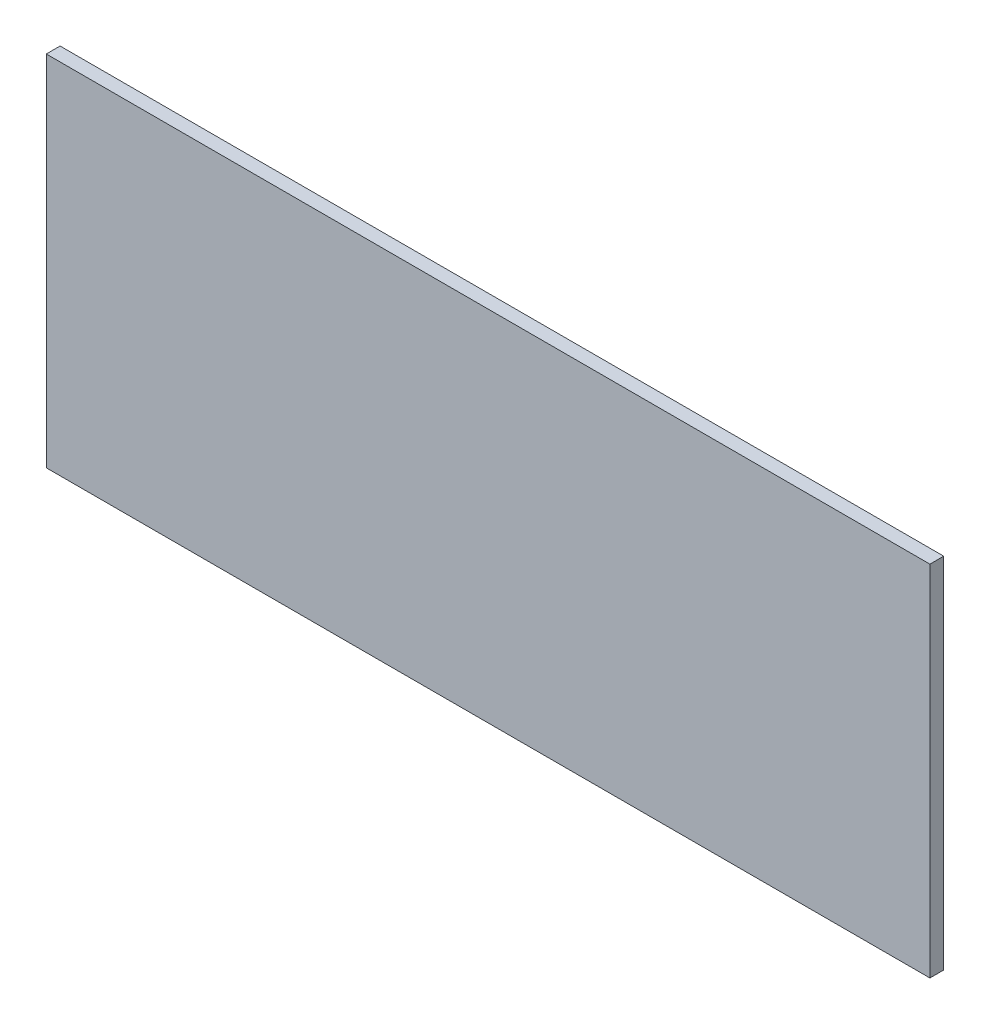
ISO-10303-21;
HEADER;
FILE_DESCRIPTION(('STEP AP214'),'2;1');
FILE_NAME('part.step','',(''),(''),'','','');
FILE_SCHEMA(('AUTOMOTIVE_DESIGN { 1 0 10303 214 1 1 1 1 }'));
ENDSEC;
DATA;
#1=APPLICATION_CONTEXT('core data for automotive mechanical design processes');
#2=APPLICATION_PROTOCOL_DEFINITION('international standard','automotive_design',2000,#1);
#3=PRODUCT_CONTEXT('',#1,'mechanical');
#4=PRODUCT('Part','Part','',(#3));
#5=PRODUCT_RELATED_PRODUCT_CATEGORY('part','',(#4));
#6=PRODUCT_DEFINITION_FORMATION('','',#4);
#7=PRODUCT_DEFINITION_CONTEXT('part definition',#1,'design');
#8=PRODUCT_DEFINITION('design','',#6,#7);
#9=PRODUCT_DEFINITION_SHAPE('','',#8);
#10=(LENGTH_UNIT() NAMED_UNIT(*) SI_UNIT(.MILLI.,.METRE.));
#11=(NAMED_UNIT(*) PLANE_ANGLE_UNIT() SI_UNIT($,.RADIAN.));
#12=(NAMED_UNIT(*) SI_UNIT($,.STERADIAN.) SOLID_ANGLE_UNIT());
#13=UNCERTAINTY_MEASURE_WITH_UNIT(LENGTH_MEASURE(1.E-05),#10,'distance_accuracy_value','');
#14=(GEOMETRIC_REPRESENTATION_CONTEXT(3) GLOBAL_UNCERTAINTY_ASSIGNED_CONTEXT((#13)) GLOBAL_UNIT_ASSIGNED_CONTEXT((#10,
#11,#12)) REPRESENTATION_CONTEXT('',''));
#15=CARTESIAN_POINT('',(0.,0.,0.));
#16=DIRECTION('',(0.,0.,1.));
#17=DIRECTION('',(1.,0.,0.));
#18=AXIS2_PLACEMENT_3D('',#15,#16,#17);
#19=CARTESIAN_POINT('',(80.,32.45,2.5));
#20=DIRECTION('',(-1.,0.,0.));
#21=DIRECTION('',(0.,0.,1.));
#22=AXIS2_PLACEMENT_3D('',#19,#20,#21);
#23=PLANE('',#22);
#24=DIRECTION('',(0.,1.,0.));
#25=VECTOR('',#24,1.);
#26=CARTESIAN_POINT('',(80.,32.45,0.));
#27=LINE('',#26,#25);
#28=CARTESIAN_POINT('',(80.,-32.45,0.));
#29=VERTEX_POINT('',#28);
#30=CARTESIAN_POINT('',(80.,32.45,0.));
#31=VERTEX_POINT('',#30);
#32=EDGE_CURVE('E102',#29,#31,#27,.T.);
#33=ORIENTED_EDGE('',*,*,#32,.T.);
#34=DIRECTION('',(0.,0.,-1.));
#35=VECTOR('',#34,1.);
#36=CARTESIAN_POINT('',(80.,32.45,2.5));
#37=LINE('',#36,#35);
#38=CARTESIAN_POINT('',(80.,32.45,2.5));
#39=VERTEX_POINT('',#38);
#40=EDGE_CURVE('E11',#39,#31,#37,.T.);
#41=ORIENTED_EDGE('',*,*,#40,.F.);
#42=DIRECTION('',(0.,1.,0.));
#43=VECTOR('',#42,1.);
#44=CARTESIAN_POINT('',(80.,32.45,2.5));
#45=LINE('',#44,#43);
#46=CARTESIAN_POINT('',(80.,-32.45,2.5));
#47=VERTEX_POINT('',#46);
#48=EDGE_CURVE('E90',#47,#39,#45,.T.);
#49=ORIENTED_EDGE('',*,*,#48,.F.);
#50=DIRECTION('',(0.,0.,-1.));
#51=VECTOR('',#50,1.);
#52=CARTESIAN_POINT('',(80.,-32.45,2.5));
#53=LINE('',#52,#51);
#54=EDGE_CURVE('E98',#47,#29,#53,.T.);
#55=ORIENTED_EDGE('',*,*,#54,.T.);
#56=EDGE_LOOP('',(#33,#41,#49,#55));
#57=FACE_BOUND('',#56,.T.);
#58=ADVANCED_FACE('F39',(#57),#23,.F.);
#59=CARTESIAN_POINT('',(-80.,32.45,2.5));
#60=DIRECTION('',(0.,-1.,0.));
#61=DIRECTION('',(0.,0.,-1.));
#62=AXIS2_PLACEMENT_3D('',#59,#60,#61);
#63=PLANE('',#62);
#64=DIRECTION('',(-1.,0.,0.));
#65=VECTOR('',#64,1.);
#66=CARTESIAN_POINT('',(-80.,32.45,0.));
#67=LINE('',#66,#65);
#68=CARTESIAN_POINT('',(-80.,32.45,0.));
#69=VERTEX_POINT('',#68);
#70=EDGE_CURVE('E94',#31,#69,#67,.T.);
#71=ORIENTED_EDGE('',*,*,#70,.T.);
#72=DIRECTION('',(0.,0.,-1.));
#73=VECTOR('',#72,1.);
#74=CARTESIAN_POINT('',(-80.,32.45,2.5));
#75=LINE('',#74,#73);
#76=CARTESIAN_POINT('',(-80.,32.45,2.5));
#77=VERTEX_POINT('',#76);
#78=EDGE_CURVE('E47',#77,#69,#75,.T.);
#79=ORIENTED_EDGE('',*,*,#78,.F.);
#80=DIRECTION('',(-1.,0.,0.));
#81=VECTOR('',#80,1.);
#82=CARTESIAN_POINT('',(-80.,32.45,2.5));
#83=LINE('',#82,#81);
#84=EDGE_CURVE('E85',#39,#77,#83,.T.);
#85=ORIENTED_EDGE('',*,*,#84,.F.);
#86=ORIENTED_EDGE('',*,*,#40,.T.);
#87=EDGE_LOOP('',(#71,#79,#85,#86));
#88=FACE_BOUND('',#87,.T.);
#89=ADVANCED_FACE('F93',(#88),#63,.F.);
#90=CARTESIAN_POINT('',(-80.,32.45,2.5));
#91=DIRECTION('',(1.,0.,0.));
#92=DIRECTION('',(0.,1.,0.));
#93=AXIS2_PLACEMENT_3D('',#90,#91,#92);
#94=PLANE('',#93);
#95=DIRECTION('',(0.,-1.,0.));
#96=VECTOR('',#95,1.);
#97=CARTESIAN_POINT('',(-80.,32.45,0.));
#98=LINE('',#97,#96);
#99=CARTESIAN_POINT('',(-80.,-32.45,0.));
#100=VERTEX_POINT('',#99);
#101=EDGE_CURVE('E72',#69,#100,#98,.T.);
#102=ORIENTED_EDGE('',*,*,#101,.T.);
#103=DIRECTION('',(0.,0.,-1.));
#104=VECTOR('',#103,1.);
#105=CARTESIAN_POINT('',(-80.,-32.45,2.5));
#106=LINE('',#105,#104);
#107=CARTESIAN_POINT('',(-80.,-32.45,2.5));
#108=VERTEX_POINT('',#107);
#109=EDGE_CURVE('E95',#108,#100,#106,.T.);
#110=ORIENTED_EDGE('',*,*,#109,.F.);
#111=DIRECTION('',(0.,-1.,0.));
#112=VECTOR('',#111,1.);
#113=CARTESIAN_POINT('',(-80.,32.45,2.5));
#114=LINE('',#113,#112);
#115=EDGE_CURVE('E88',#77,#108,#114,.T.);
#116=ORIENTED_EDGE('',*,*,#115,.F.);
#117=ORIENTED_EDGE('',*,*,#78,.T.);
#118=EDGE_LOOP('',(#102,#110,#116,#117));
#119=FACE_BOUND('',#118,.T.);
#120=ADVANCED_FACE('F96',(#119),#94,.F.);
#121=CARTESIAN_POINT('',(-80.,-32.45,2.5));
#122=DIRECTION('',(0.,1.,0.));
#123=DIRECTION('',(0.,0.,1.));
#124=AXIS2_PLACEMENT_3D('',#121,#122,#123);
#125=PLANE('',#124);
#126=DIRECTION('',(1.,0.,0.));
#127=VECTOR('',#126,1.);
#128=CARTESIAN_POINT('',(-80.,-32.45,0.));
#129=LINE('',#128,#127);
#130=EDGE_CURVE('E78',#100,#29,#129,.T.);
#131=ORIENTED_EDGE('',*,*,#130,.T.);
#132=ORIENTED_EDGE('',*,*,#54,.F.);
#133=DIRECTION('',(1.,0.,0.));
#134=VECTOR('',#133,1.);
#135=CARTESIAN_POINT('',(-80.,-32.45,2.5));
#136=LINE('',#135,#134);
#137=EDGE_CURVE('E55',#108,#47,#136,.T.);
#138=ORIENTED_EDGE('',*,*,#137,.F.);
#139=ORIENTED_EDGE('',*,*,#109,.T.);
#140=EDGE_LOOP('',(#131,#132,#138,#139));
#141=FACE_BOUND('',#140,.T.);
#142=ADVANCED_FACE('F109',(#141),#125,.F.);
#143=CARTESIAN_POINT('',(0.,0.,2.5));
#144=DIRECTION('',(0.,0.,1.));
#145=DIRECTION('',(1.,0.,0.));
#146=AXIS2_PLACEMENT_3D('',#143,#144,#145);
#147=PLANE('',#146);
#148=ORIENTED_EDGE('',*,*,#48,.T.);
#149=ORIENTED_EDGE('',*,*,#84,.T.);
#150=ORIENTED_EDGE('',*,*,#115,.T.);
#151=ORIENTED_EDGE('',*,*,#137,.T.);
#152=EDGE_LOOP('',(#148,#149,#150,#151));
#153=FACE_BOUND('',#152,.T.);
#154=ADVANCED_FACE('F86',(#153),#147,.T.);
#155=CARTESIAN_POINT('',(0.,0.,0.));
#156=DIRECTION('',(0.,0.,1.));
#157=DIRECTION('',(1.,0.,0.));
#158=AXIS2_PLACEMENT_3D('',#155,#156,#157);
#159=PLANE('',#158);
#160=ORIENTED_EDGE('',*,*,#32,.F.);
#161=ORIENTED_EDGE('',*,*,#130,.F.);
#162=ORIENTED_EDGE('',*,*,#101,.F.);
#163=ORIENTED_EDGE('',*,*,#70,.F.);
#164=EDGE_LOOP('',(#160,#161,#162,#163));
#165=FACE_BOUND('',#164,.T.);
#166=ADVANCED_FACE('F112',(#165),#159,.F.);
#167=CLOSED_SHELL('',(#58,#89,#120,#142,#154,#166));
#168=MANIFOLD_SOLID_BREP('B2',#167);
#169=ADVANCED_BREP_SHAPE_REPRESENTATION('',(#18,#168),#14);
#170=SHAPE_DEFINITION_REPRESENTATION(#9,#169);
ENDSEC;
END-ISO-10303-21;
